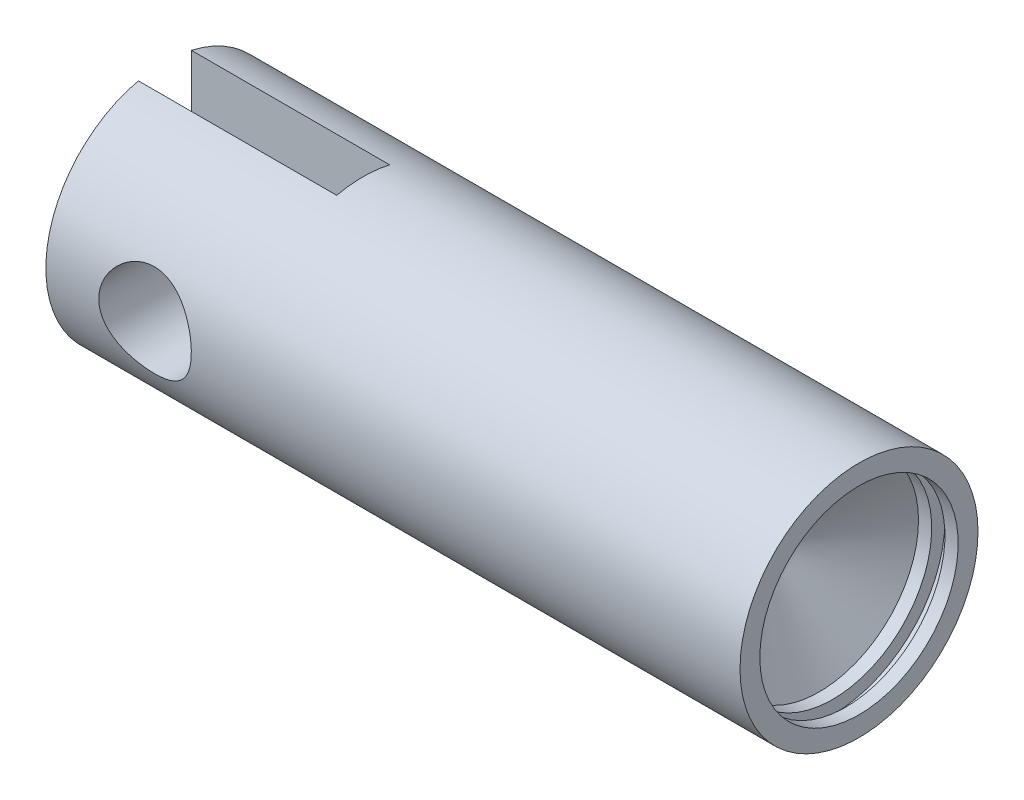
ISO-10303-21;
HEADER;
FILE_DESCRIPTION(('STEP AP214'),'2;1');
FILE_NAME('part.step','',(''),(''),'','','');
FILE_SCHEMA(('AUTOMOTIVE_DESIGN { 1 0 10303 214 1 1 1 1 }'));
ENDSEC;
DATA;
#1=APPLICATION_CONTEXT('core data for automotive mechanical design processes');
#2=APPLICATION_PROTOCOL_DEFINITION('international standard','automotive_design',2000,#1);
#3=PRODUCT_CONTEXT('',#1,'mechanical');
#4=PRODUCT('Part','Part','',(#3));
#5=PRODUCT_RELATED_PRODUCT_CATEGORY('part','',(#4));
#6=PRODUCT_DEFINITION_FORMATION('','',#4);
#7=PRODUCT_DEFINITION_CONTEXT('part definition',#1,'design');
#8=PRODUCT_DEFINITION('design','',#6,#7);
#9=PRODUCT_DEFINITION_SHAPE('','',#8);
#10=(LENGTH_UNIT() NAMED_UNIT(*) SI_UNIT(.MILLI.,.METRE.));
#11=(NAMED_UNIT(*) PLANE_ANGLE_UNIT() SI_UNIT($,.RADIAN.));
#12=(NAMED_UNIT(*) SI_UNIT($,.STERADIAN.) SOLID_ANGLE_UNIT());
#13=UNCERTAINTY_MEASURE_WITH_UNIT(LENGTH_MEASURE(1.E-05),#10,'distance_accuracy_value','');
#14=(GEOMETRIC_REPRESENTATION_CONTEXT(3) GLOBAL_UNCERTAINTY_ASSIGNED_CONTEXT((#13)) GLOBAL_UNIT_ASSIGNED_CONTEXT((#10,
#11,#12)) REPRESENTATION_CONTEXT('',''));
#15=CARTESIAN_POINT('',(0.,0.,0.));
#16=DIRECTION('',(0.,0.,1.));
#17=DIRECTION('',(1.,0.,0.));
#18=AXIS2_PLACEMENT_3D('',#15,#16,#17);
#19=CARTESIAN_POINT('',(30.,17.5499287747884,-3.99999999999915));
#20=DIRECTION('',(0.,0.,-1.));
#21=DIRECTION('',(0.,1.,0.));
#22=AXIS2_PLACEMENT_3D('',#19,#20,#21);
#23=PLANE('',#22);
#24=DIRECTION('',(0.,-1.,0.));
#25=VECTOR('',#24,1.);
#26=CARTESIAN_POINT('',(0.,17.5499287747884,-3.99999999999915));
#27=LINE('',#26,#25);
#28=CARTESIAN_POINT('',(0.,17.5499287747844,-3.99999999999915));
#29=VERTEX_POINT('',#28);
#30=CARTESIAN_POINT('',(0.,-17.5499287747884,-3.99999999999914));
#31=VERTEX_POINT('',#30);
#32=EDGE_CURVE('E117',#29,#31,#27,.T.);
#33=ORIENTED_EDGE('',*,*,#32,.T.);
#34=DIRECTION('',(-1.,0.,0.));
#35=VECTOR('',#34,1.);
#36=CARTESIAN_POINT('',(30.,-17.5499287747884,-3.99999999999914));
#37=LINE('',#36,#35);
#38=CARTESIAN_POINT('',(30.,-17.5499287747884,-3.99999999999914));
#39=VERTEX_POINT('',#38);
#40=EDGE_CURVE('E125',#39,#31,#37,.T.);
#41=ORIENTED_EDGE('',*,*,#40,.F.);
#42=DIRECTION('',(0.,-1.,0.));
#43=VECTOR('',#42,1.);
#44=CARTESIAN_POINT('',(30.,17.5499287747884,-3.99999999999915));
#45=LINE('',#44,#43);
#46=CARTESIAN_POINT('',(30.,17.5499287747884,-3.99999999999915));
#47=VERTEX_POINT('',#46);
#48=EDGE_CURVE('E132',#47,#39,#45,.T.);
#49=ORIENTED_EDGE('',*,*,#48,.F.);
#50=DIRECTION('',(-1.,0.,0.));
#51=VECTOR('',#50,1.);
#52=CARTESIAN_POINT('',(30.,17.5499287747884,-3.99999999999915));
#53=LINE('',#52,#51);
#54=EDGE_CURVE('E58',#47,#29,#53,.T.);
#55=ORIENTED_EDGE('',*,*,#54,.T.);
#56=EDGE_LOOP('',(#33,#41,#49,#55));
#57=FACE_BOUND('',#56,.T.);
#58=CARTESIAN_POINT('',(15.,0.,-3.99999999999914));
#59=DIRECTION('',(0.,0.,1.));
#60=DIRECTION('',(1.,0.,0.));
#61=AXIS2_PLACEMENT_3D('',#58,#59,#60);
#62=CIRCLE('',#61,6.99999999999999);
#63=CARTESIAN_POINT('',(22.,0.,-3.99999999999914));
#64=VERTEX_POINT('',#63);
#65=EDGE_CURVE('E191',#64,#64,#62,.T.);
#66=ORIENTED_EDGE('',*,*,#65,.F.);
#67=EDGE_LOOP('',(#66));
#68=FACE_BOUND('',#67,.T.);
#69=ADVANCED_FACE('F35',(#57,#68),#23,.F.);
#70=CARTESIAN_POINT('',(0.,-17.5499287747884,3.99999999999915));
#71=DIRECTION('',(0.,0.,1.));
#72=DIRECTION('',(0.,-1.,0.));
#73=AXIS2_PLACEMENT_3D('',#70,#71,#72);
#74=PLANE('',#73);
#75=DIRECTION('',(0.,-1.,0.));
#76=VECTOR('',#75,1.);
#77=CARTESIAN_POINT('',(30.,-17.5499287747884,3.99999999999915));
#78=LINE('',#77,#76);
#79=CARTESIAN_POINT('',(30.,17.5499287747884,3.99999999999915));
#80=VERTEX_POINT('',#79);
#81=CARTESIAN_POINT('',(30.,-17.5499287747884,3.99999999999915));
#82=VERTEX_POINT('',#81);
#83=EDGE_CURVE('E145',#80,#82,#78,.T.);
#84=ORIENTED_EDGE('',*,*,#83,.T.);
#85=DIRECTION('',(1.,0.,0.));
#86=VECTOR('',#85,1.);
#87=CARTESIAN_POINT('',(0.,-17.5499287747884,3.99999999999915));
#88=LINE('',#87,#86);
#89=CARTESIAN_POINT('',(0.,-17.5499287747884,3.99999999999915));
#90=VERTEX_POINT('',#89);
#91=EDGE_CURVE('E138',#90,#82,#88,.T.);
#92=ORIENTED_EDGE('',*,*,#91,.F.);
#93=DIRECTION('',(0.,-1.,0.));
#94=VECTOR('',#93,1.);
#95=CARTESIAN_POINT('',(0.,-17.5499287747884,3.99999999999915));
#96=LINE('',#95,#94);
#97=CARTESIAN_POINT('',(0.,17.5499287747884,3.99999999999915));
#98=VERTEX_POINT('',#97);
#99=EDGE_CURVE('E140',#98,#90,#96,.T.);
#100=ORIENTED_EDGE('',*,*,#99,.F.);
#101=DIRECTION('',(1.,0.,0.));
#102=VECTOR('',#101,1.);
#103=CARTESIAN_POINT('',(0.,17.5499287747884,3.99999999999915));
#104=LINE('',#103,#102);
#105=EDGE_CURVE('E50',#98,#80,#104,.T.);
#106=ORIENTED_EDGE('',*,*,#105,.T.);
#107=EDGE_LOOP('',(#84,#92,#100,#106));
#108=FACE_BOUND('',#107,.T.);
#109=CARTESIAN_POINT('',(15.,0.,3.99999999999915));
#110=DIRECTION('',(0.,0.,-1.));
#111=DIRECTION('',(0.,1.,0.));
#112=AXIS2_PLACEMENT_3D('',#109,#110,#111);
#113=CIRCLE('',#112,6.99999999999999);
#114=CARTESIAN_POINT('',(15.,6.99999999999999,3.99999999999915));
#115=VERTEX_POINT('',#114);
#116=EDGE_CURVE('E172',#115,#115,#113,.T.);
#117=ORIENTED_EDGE('',*,*,#116,.F.);
#118=EDGE_LOOP('',(#117));
#119=FACE_BOUND('',#118,.T.);
#120=ADVANCED_FACE('F96',(#108,#119),#74,.F.);
#121=CARTESIAN_POINT('',(30.,0.,0.));
#122=DIRECTION('',(-1.,0.,0.));
#123=DIRECTION('',(0.,0.,1.));
#124=AXIS2_PLACEMENT_3D('',#121,#122,#123);
#125=PLANE('',#124);
#126=CARTESIAN_POINT('',(30.,0.,0.));
#127=DIRECTION('',(-1.,0.,0.));
#128=DIRECTION('',(0.,0.,1.));
#129=AXIS2_PLACEMENT_3D('',#126,#127,#128);
#130=CIRCLE('',#129,18.0000000000038);
#131=EDGE_CURVE('E128',#39,#82,#130,.T.);
#132=ORIENTED_EDGE('',*,*,#131,.T.);
#133=ORIENTED_EDGE('',*,*,#83,.F.);
#134=EDGE_CURVE('E119',#80,#47,#130,.T.);
#135=ORIENTED_EDGE('',*,*,#134,.T.);
#136=ORIENTED_EDGE('',*,*,#48,.T.);
#137=EDGE_LOOP('',(#132,#133,#135,#136));
#138=FACE_BOUND('',#137,.T.);
#139=ADVANCED_FACE('F101',(#138),#125,.T.);
#140=CARTESIAN_POINT('',(0.,0.,0.));
#141=DIRECTION('',(1.,0.,0.));
#142=DIRECTION('',(0.,0.,-1.));
#143=AXIS2_PLACEMENT_3D('',#140,#141,#142);
#144=CYLINDRICAL_SURFACE('',#143,18.);
#145=CARTESIAN_POINT('',(8.00000000000001,0.,-18.));
#146=CARTESIAN_POINT('',(7.99999877163177,0.189022900178527,-18.0000009208547));
#147=CARTESIAN_POINT('',(8.00766202753387,0.378029556462484,-17.9970162909539));
#148=CARTESIAN_POINT('',(8.0382308714732,0.754619998576976,-17.9851613111076));
#149=CARTESIAN_POINT('',(8.06113593473041,0.9422038331708,-17.9762911638023));
#150=CARTESIAN_POINT('',(8.12194538683635,1.31451020157856,-17.9529064582995));
#151=CARTESIAN_POINT('',(8.15984587512876,1.49923346649966,-17.9383933679412));
#152=CARTESIAN_POINT('',(8.25027376964932,1.86456675510352,-17.9041072154366));
#153=CARTESIAN_POINT('',(8.30280166743677,2.04517664033399,-17.8843339765221));
#154=CARTESIAN_POINT('',(8.42186250909201,2.40065949507787,-17.8400910181496));
#155=CARTESIAN_POINT('',(8.48836353086228,2.57554450836756,-17.8156320145383));
#156=CARTESIAN_POINT('',(8.63490029203148,2.9189677930884,-17.7625963642901));
#157=CARTESIAN_POINT('',(8.71494074813499,3.0875038276357,-17.7340182832136));
#158=CARTESIAN_POINT('',(8.88790662276241,3.41715655500486,-17.6734582342022));
#159=CARTESIAN_POINT('',(8.98083049039882,3.5782741377447,-17.6414766760807));
#160=CARTESIAN_POINT('',(9.17894849436442,3.89227914275452,-17.5748665993156));
#161=CARTESIAN_POINT('',(9.28414706872086,4.04516355886975,-17.5402371248642));
#162=CARTESIAN_POINT('',(9.51061675484618,4.34785369100651,-17.4677233944295));
#163=CARTESIAN_POINT('',(9.63236649431697,4.49728345532205,-17.4297641064102));
#164=CARTESIAN_POINT('',(9.88762487385915,4.7854650103583,-17.3528548422097));
#165=CARTESIAN_POINT('',(10.021133887595,4.92421646150064,-17.3139048345752));
#166=CARTESIAN_POINT('',(10.2991940978516,5.19032503575433,-17.2360018270607));
#167=CARTESIAN_POINT('',(10.4437507057338,5.31767650772321,-17.1970488351724));
#168=CARTESIAN_POINT('',(10.7429852422145,5.56011631767769,-17.1202008105665));
#169=CARTESIAN_POINT('',(10.8976597568723,5.67520875795339,-17.0823054270897));
#170=CARTESIAN_POINT('',(11.2230349470368,5.8970258415522,-17.0070390963215));
#171=CARTESIAN_POINT('',(11.3941361617003,6.0031943031787,-16.9697573747049));
#172=CARTESIAN_POINT('',(11.745332601565,6.2006211312136,-16.8986185657432));
#173=CARTESIAN_POINT('',(11.9254244060335,6.29188511285885,-16.864760190498));
#174=CARTESIAN_POINT('',(12.2934662837199,6.45875311212804,-16.8015616289996));
#175=CARTESIAN_POINT('',(12.4814153071117,6.53435921386094,-16.772220841576));
#176=CARTESIAN_POINT('',(12.8638611580555,6.66918382637007,-16.7190683421261));
#177=CARTESIAN_POINT('',(13.0583575676936,6.72840338086888,-16.6952562779695));
#178=CARTESIAN_POINT('',(13.4438521316817,6.82761155137091,-16.6549231017409));
#179=CARTESIAN_POINT('',(13.634635798561,6.86832321082169,-16.6381304270352));
#180=CARTESIAN_POINT('',(14.0193787391505,6.9337183849563,-16.610984565868));
#181=CARTESIAN_POINT('',(14.2133377989043,6.95840297501636,-16.6006309473639));
#182=CARTESIAN_POINT('',(14.6028132230369,6.99145371248836,-16.586738613915));
#183=CARTESIAN_POINT('',(14.7983289832691,6.99982590767257,-16.5831973733075));
#184=CARTESIAN_POINT('',(15.1893731871952,7.0001686910317,-16.583052810344));
#185=CARTESIAN_POINT('',(15.3849016299824,6.99213998431722,-16.5864491897247));
#186=CARTESIAN_POINT('',(15.7616095749807,6.96084085820887,-16.5996070428288));
#187=CARTESIAN_POINT('',(15.9428910203047,6.93860183522661,-16.6089376087284));
#188=CARTESIAN_POINT('',(16.30285184566,6.8801042902642,-16.6332548734901));
#189=CARTESIAN_POINT('',(16.4815303621113,6.84384122067606,-16.6482434070357));
#190=CARTESIAN_POINT('',(16.8349854261477,6.75765586702763,-16.683412372051));
#191=CARTESIAN_POINT('',(17.0097629263059,6.7077369578859,-16.703591520633));
#192=CARTESIAN_POINT('',(17.3544388925943,6.59465916050385,-16.7485572520829));
#193=CARTESIAN_POINT('',(17.5243354588096,6.531495193909,-16.7733456017738));
#194=CARTESIAN_POINT('',(17.8614342235285,6.39110118759295,-16.82734642543));
#195=CARTESIAN_POINT('',(18.0285204777467,6.31362237478763,-16.8566352977992));
#196=CARTESIAN_POINT('',(18.3556537183782,6.14600522154402,-16.9184691455942));
#197=CARTESIAN_POINT('',(18.5156982928699,6.05586258713523,-16.9510152243725));
#198=CARTESIAN_POINT('',(18.8278716435968,5.86353255645025,-17.0185008071045));
#199=CARTESIAN_POINT('',(18.9799994265927,5.76134365407754,-17.0534406101067));
#200=CARTESIAN_POINT('',(19.2755564849081,5.54554789897213,-17.1248303146976));
#201=CARTESIAN_POINT('',(19.4189853359592,5.43194049004761,-17.1612802897953));
#202=CARTESIAN_POINT('',(19.7065515880351,5.18525090976585,-17.237488999054));
#203=CARTESIAN_POINT('',(19.8499773545664,5.05135263393821,-17.2772951275342));
#204=CARTESIAN_POINT('',(20.1250946367338,4.77198380388806,-17.3565331511009));
#205=CARTESIAN_POINT('',(20.2567896456181,4.62651671927617,-17.3959651544501));
#206=CARTESIAN_POINT('',(20.5077440220317,4.32472983792493,-17.4734366912438));
#207=CARTESIAN_POINT('',(20.626996438517,4.16840405534709,-17.5114754387286));
#208=CARTESIAN_POINT('',(20.8521226147386,3.84594718277663,-17.5851080736286));
#209=CARTESIAN_POINT('',(20.9580017141785,3.67982004539237,-17.6207029342324));
#210=CARTESIAN_POINT('',(21.1574465839447,3.33558623984551,-17.6891269218138));
#211=CARTESIAN_POINT('',(21.2507523190637,3.15731625673586,-17.7218937056245));
#212=CARTESIAN_POINT('',(21.4218805210754,2.79284146450667,-17.782973891696));
#213=CARTESIAN_POINT('',(21.4997091787971,2.60663986436766,-17.811289073644));
#214=CARTESIAN_POINT('',(21.6391715945256,2.22759348063694,-17.8626536301049));
#215=CARTESIAN_POINT('',(21.7008082230189,2.03474988138952,-17.8857039378683));
#216=CARTESIAN_POINT('',(21.8072544583429,1.64386977785006,-17.9258550536686));
#217=CARTESIAN_POINT('',(21.8520651583151,1.44583361180157,-17.9429562482004));
#218=CARTESIAN_POINT('',(21.9223149845053,1.05748077820151,-17.9699041828516));
#219=CARTESIAN_POINT('',(21.9487059179292,0.867360509164302,-17.9801063423545));
#220=CARTESIAN_POINT('',(21.9857878743697,0.485371080182076,-17.9944696419145));
#221=CARTESIAN_POINT('',(21.9964796173466,0.293502000843053,-17.9986310589982));
#222=CARTESIAN_POINT('',(22.0020479375566,-0.090459405330065,-18.0007963490226));
#223=CARTESIAN_POINT('',(21.9969277927261,-0.282551677641392,-17.9988014982092));
#224=CARTESIAN_POINT('',(21.9709350222173,-0.665503375076277,-17.9887128868814));
#225=CARTESIAN_POINT('',(21.9500626694723,-0.856362821502823,-17.980619232039));
#226=CARTESIAN_POINT('',(21.8940003311959,-1.22738012361879,-17.9590257121867));
#227=CARTESIAN_POINT('',(21.859451965618,-1.40764961369414,-17.9457684957337));
#228=CARTESIAN_POINT('',(21.7764231959551,-1.76455917223371,-17.9141965268711));
#229=CARTESIAN_POINT('',(21.727938219127,-1.94119802903447,-17.8958801145654));
#230=CARTESIAN_POINT('',(21.6174868653815,-2.28959732376108,-17.8546495416103));
#231=CARTESIAN_POINT('',(21.5555241965914,-2.4613590888587,-17.8317366457293));
#232=CARTESIAN_POINT('',(21.4185958115425,-2.79907910782926,-17.7818533163451));
#233=CARTESIAN_POINT('',(21.3436251532677,-2.96503512707432,-17.7548813412285));
#234=CARTESIAN_POINT('',(21.1788475539973,-3.29497337994161,-17.696667533927));
#235=CARTESIAN_POINT('',(21.0886656702547,-3.4587501066948,-17.6653225666838));
#236=CARTESIAN_POINT('',(20.8957586183553,-3.77820881792742,-17.5997653465878));
#237=CARTESIAN_POINT('',(20.7930291470216,-3.9338879991195,-17.5655521113354));
#238=CARTESIAN_POINT('',(20.5757131397511,-4.23628328543234,-17.4950853783795));
#239=CARTESIAN_POINT('',(20.4611247099329,-4.38299795294747,-17.4588315552162));
#240=CARTESIAN_POINT('',(20.2207940206465,-4.66667675024355,-17.3851548379621));
#241=CARTESIAN_POINT('',(20.095051310869,-4.80364048596697,-17.3477318967124));
#242=CARTESIAN_POINT('',(19.8248986311353,-5.07536393749629,-17.2702597460267));
#243=CARTESIAN_POINT('',(19.6798126145301,-5.20944741445195,-17.2301929476455));
#244=CARTESIAN_POINT('',(19.3787518605832,-5.46493358179961,-17.1508714679136));
#245=CARTESIAN_POINT('',(19.2227805751698,-5.58634026203641,-17.1116165341782));
#246=CARTESIAN_POINT('',(18.9007254882981,-5.81579327720082,-17.0349989757533));
#247=CARTESIAN_POINT('',(18.7346362952503,-5.92383239427614,-16.9976373797493));
#248=CARTESIAN_POINT('',(18.3934750322044,-6.12565012207101,-16.9259528059704));
#249=CARTESIAN_POINT('',(18.2184067825543,-6.21943473147827,-16.8916285525535));
#250=CARTESIAN_POINT('',(17.8589525651865,-6.39269060733609,-16.8268277439491));
#251=CARTESIAN_POINT('',(17.6745061810053,-6.47204835125026,-16.7963822262176));
#252=CARTESIAN_POINT('',(17.2988589562015,-6.61480150738732,-16.7406772868191));
#253=CARTESIAN_POINT('',(17.1076610192138,-6.67820368852061,-16.7154156668028));
#254=CARTESIAN_POINT('',(16.7199157805218,-6.78840894602035,-16.6709639534454));
#255=CARTESIAN_POINT('',(16.5233703985785,-6.83521789694062,-16.6517717116032));
#256=CARTESIAN_POINT('',(16.1264440490539,-6.91172661427567,-16.6201611539775));
#257=CARTESIAN_POINT('',(15.9260633791263,-6.94142770289986,-16.6077423147044));
#258=CARTESIAN_POINT('',(15.536996100839,-6.9819213566805,-16.5907569628281));
#259=CARTESIAN_POINT('',(15.3484500694618,-6.99387109240177,-16.5857102986191));
#260=CARTESIAN_POINT('',(14.9709492443818,-7.00248500762121,-16.5820755174959));
#261=CARTESIAN_POINT('',(14.7819944665941,-6.99914977192882,-16.5834871534844));
#262=CARTESIAN_POINT('',(14.4051531955539,-6.97723284578585,-16.592720118049));
#263=CARTESIAN_POINT('',(14.21726658829,-6.9586528144681,-16.6005407491165));
#264=CARTESIAN_POINT('',(13.8439590479773,-6.90645280959917,-16.6223255636815));
#265=CARTESIAN_POINT('',(13.6585381083135,-6.87283287640587,-16.6362897306936));
#266=CARTESIAN_POINT('',(13.2980402415482,-6.79236485986737,-16.6693009987579));
#267=CARTESIAN_POINT('',(13.1228300364028,-6.74603016350141,-16.688149505643));
#268=CARTESIAN_POINT('',(12.7769967073649,-6.64010367997225,-16.7305790866883));
#269=CARTESIAN_POINT('',(12.6063751066609,-6.58050755009856,-16.7541617108778));
#270=CARTESIAN_POINT('',(12.2707956133919,-6.44856072715021,-16.8053880459059));
#271=CARTESIAN_POINT('',(12.1058368326919,-6.37621204515715,-16.8330311162965));
#272=CARTESIAN_POINT('',(11.7824247617755,-6.21928928238683,-16.891638582713));
#273=CARTESIAN_POINT('',(11.6239740303943,-6.13471045093825,-16.922604268162));
#274=CARTESIAN_POINT('',(11.1427026763286,-5.85354969616637,-17.022836929794));
#275=CARTESIAN_POINT('',(10.832339438266,-5.63672493370866,-17.0965173551352));
#276=CARTESIAN_POINT('',(10.2509761190353,-5.15645525559416,-17.2474378809038));
#277=CARTESIAN_POINT('',(9.9799890674931,-4.89299497186818,-17.3246791485313));
#278=CARTESIAN_POINT('',(9.60017410927497,-4.45891382375773,-17.4396791777228));
#279=CARTESIAN_POINT('',(9.47494185076698,-4.30277213888834,-17.4789502311137));
#280=CARTESIAN_POINT('',(9.23809110218057,-3.9800036583569,-17.5552562694741));
#281=CARTESIAN_POINT('',(9.12646760311397,-3.81338075496761,-17.5922920746234));
#282=CARTESIAN_POINT('',(8.91759749101006,-3.47054816799777,-17.6631242394416));
#283=CARTESIAN_POINT('',(8.82036043825045,-3.29433221494907,-17.6969184397567));
#284=CARTESIAN_POINT('',(8.64120231869494,-2.93363627499294,-17.7602727701874));
#285=CARTESIAN_POINT('',(8.55927490643538,-2.74915975136256,-17.7898346532993));
#286=CARTESIAN_POINT('',(8.40585634402471,-2.35891513657034,-17.8459307335606));
#287=CARTESIAN_POINT('',(8.33562444739601,-2.15259234031402,-17.8720664148204));
#288=CARTESIAN_POINT('',(8.21455528641545,-1.73357991619569,-17.917564278894));
#289=CARTESIAN_POINT('',(8.16371962488026,-1.52088976372987,-17.9369259019194));
#290=CARTESIAN_POINT('',(8.08212905092707,-1.0912590383903,-17.9681806798842));
#291=CARTESIAN_POINT('',(8.05136391194008,-0.87432068824148,-17.9800776381891));
#292=CARTESIAN_POINT('',(8.01030171598621,-0.438247381222032,-17.9959861413564));
#293=CARTESIAN_POINT('',(8.00000142390778,-0.219112777043785,-17.9999989325577));
#294=CARTESIAN_POINT('',(8.00000000000001,0.,-18.));
#295=B_SPLINE_CURVE_WITH_KNOTS('',3,(#145,#146,#147,#148,#149,#150,#151,#152,#153,#154,#155,
#156,#157,#158,#159,#160,#161,#162,#163,#164,#165,#166,#167,#168,#169,#170,#171,#172,#173,#174,
#175,#176,#177,#178,#179,#180,#181,#182,#183,#184,#185,#186,#187,#188,#189,#190,#191,#192,#193,
#194,#195,#196,#197,#198,#199,#200,#201,#202,#203,#204,#205,#206,#207,#208,#209,#210,#211,#212,
#213,#214,#215,#216,#217,#218,#219,#220,#221,#222,#223,#224,#225,#226,#227,#228,#229,#230,#231,
#232,#233,#234,#235,#236,#237,#238,#239,#240,#241,#242,#243,#244,#245,#246,#247,#248,#249,#250,
#251,#252,#253,#254,#255,#256,#257,#258,#259,#260,#261,#262,#263,#264,#265,#266,#267,#268,#269,
#270,#271,#272,#273,#274,#275,#276,#277,#278,#279,#280,#281,#282,#283,#284,#285,#286,#287,#288,
#289,#290,#291,#292,#293,#294),.UNSPECIFIED.,.T.,.F.,(4,2,2,2,2,2,2,2,2,2,2,2,2,2,2,2,2,2,2,2,2,
2,2,2,2,2,2,2,2,2,2,2,2,2,2,2,2,2,2,2,2,2,2,2,2,2,2,2,2,2,2,2,2,2,2,2,2,2,2,2,2,2,2,2,2,2,2,2,2,
2,2,2,2,2,4),(0.,0.566862759352124,1.13370600245867,1.70040189716278,2.26711683818315,
2.83255090786465,3.39818236383889,3.96374578889449,4.52951433569611,5.11821464019695,
5.70693365808009,6.29594291522282,6.88475444641585,7.49835189280634,8.11171763145428,
8.72500167680878,9.33824665073364,9.92487834644438,10.5114706765685,11.0978454879039,
11.6841950902353,12.232188490834,12.780359739642,13.328395635032,13.8766420411072,
14.4355085544116,14.9945650241531,15.5536914647608,16.1128451534507,16.7127901419188,
17.312555874074,17.9126548908278,18.5125135372255,19.1233215539829,19.7338847539823,
20.3443396415584,20.9547548624394,21.5306662531041,22.1065512318175,22.6823168327752,
23.2580724578568,23.8095224039811,24.3611534933436,24.9126330035783,25.4643224934078,
26.032420335406,26.60071355567,27.1690976730936,27.7375047472013,28.3415392882368,
28.9453831411251,29.5495516313203,30.1534651626654,30.7619424965476,31.370161256143,
31.9781644705661,32.5861206881493,33.1523785687522,33.7186147842715,34.2847893829266,
34.8509624623251,35.3969849891128,35.9431865852651,36.4893021221874,37.0356303645832,
38.1874510523993,39.3396520152851,39.9509492720584,40.5620208444357,41.1734966879108,
41.7847185250417,42.4422030112358,43.099741817197,43.7569453240233,44.4140449309335),.UNSPECIFIED.);
#296=CARTESIAN_POINT('',(8.00000000000001,0.,-18.));
#297=VERTEX_POINT('',#296);
#298=EDGE_CURVE('E186',#297,#297,#295,.T.);
#299=ORIENTED_EDGE('',*,*,#298,.F.);
#300=EDGE_LOOP('',(#299));
#301=FACE_BOUND('',#300,.T.);
#302=CARTESIAN_POINT('',(15.,6.99999999999999,16.583123951777));
#303=CARTESIAN_POINT('',(14.8115900810471,7.00000128679394,16.5831227411057));
#304=CARTESIAN_POINT('',(14.623196723668,6.99238720394823,16.5863434351153));
#305=CARTESIAN_POINT('',(14.2478504071344,6.96201946274949,16.5991132379802));
#306=CARTESIAN_POINT('',(14.0608974047931,6.93926626011891,16.6086621563412));
#307=CARTESIAN_POINT('',(13.6898560140149,6.87887000409433,16.6337672101336));
#308=CARTESIAN_POINT('',(13.5057672415623,6.8412289649497,16.6493225329218));
#309=CARTESIAN_POINT('',(13.1417210462877,6.75144057491857,16.6859340999994));
#310=CARTESIAN_POINT('',(12.9617637763467,6.6992926881581,16.7069905474951));
#311=CARTESIAN_POINT('',(12.6076755033581,6.58114902000783,16.7538801539233));
#312=CARTESIAN_POINT('',(12.4335295281508,6.51519262556483,16.7796997023639));
#313=CARTESIAN_POINT('',(12.09153050467,6.36987750857182,16.8354005896117));
#314=CARTESIAN_POINT('',(11.9236796849456,6.29051409351783,16.8652833498402));
#315=CARTESIAN_POINT('',(11.5952943410424,6.11901056800262,16.9282618581035));
#316=CARTESIAN_POINT('',(11.4347591567962,6.02687161328373,16.9613573154197));
#317=CARTESIAN_POINT('',(11.1217827628084,5.83040175843883,17.0298925614112));
#318=CARTESIAN_POINT('',(10.9693445165565,5.72606643854078,17.0653331979113));
#319=CARTESIAN_POINT('',(10.6662107207034,5.50051558216541,17.1394016700591));
#320=CARTESIAN_POINT('',(10.5159590945143,5.37872643902607,17.1781007069678));
#321=CARTESIAN_POINT('',(10.2261146747707,5.12321632918427,17.2560276847205));
#322=CARTESIAN_POINT('',(10.0865221686754,4.98949504090211,17.2952556397952));
#323=CARTESIAN_POINT('',(9.81874725334541,4.71083560104523,17.3732255130968));
#324=CARTESIAN_POINT('',(9.69056948039886,4.56589293599551,17.4119672283905));
#325=CARTESIAN_POINT('',(9.44651880180743,4.26570652365337,17.4879303501059));
#326=CARTESIAN_POINT('',(9.33064164921224,4.11046636198385,17.5251522785047));
#327=CARTESIAN_POINT('',(9.10781262330678,3.78451386848839,17.5984768668056));
#328=CARTESIAN_POINT('',(9.00135807285283,3.61343970797923,17.6344852834755));
#329=CARTESIAN_POINT('',(8.80336009216198,3.26224941911282,17.702816524058));
#330=CARTESIAN_POINT('',(8.71181102771753,3.08213674111173,17.7351407391901));
#331=CARTESIAN_POINT('',(8.54439224288661,2.71403828441499,17.7951893341569));
#332=CARTESIAN_POINT('',(8.46852118182209,2.52605318057134,17.8229141072652));
#333=CARTESIAN_POINT('',(8.33319630131231,2.14356549827356,17.872949258056));
#334=CARTESIAN_POINT('',(8.27374149676238,1.94906331168149,17.8952599606157));
#335=CARTESIAN_POINT('',(8.17422589367958,1.56412606980011,17.9329074915352));
#336=CARTESIAN_POINT('',(8.13339842565049,1.37391584239362,17.9485180329237));
#337=CARTESIAN_POINT('',(8.06768363666554,0.990373427060974,17.973761074221));
#338=CARTESIAN_POINT('',(8.04279542935818,0.797041413344374,17.9833939065377));
#339=CARTESIAN_POINT('',(8.00923348678218,0.408820372835877,17.9964045554227));
#340=CARTESIAN_POINT('',(8.00055513834585,0.213931804885309,17.9997841515984));
#341=CARTESIAN_POINT('',(7.99949653775896,-0.1758932916871,18.0001957521713));
#342=CARTESIAN_POINT('',(8.00711574935668,-0.370829818519885,17.9972279654216));
#343=CARTESIAN_POINT('',(8.03772344667713,-0.748810522584479,17.9853582654493));
#344=CARTESIAN_POINT('',(8.05986951916187,-0.931933896086255,17.9767816847946));
#345=CARTESIAN_POINT('',(8.11847734125509,-1.29559937907926,17.954236885668));
#346=CARTESIAN_POINT('',(8.15494377542237,-1.4761406238393,17.9402669029007));
#347=CARTESIAN_POINT('',(8.24183447235957,-1.83329406565323,17.9072942700767));
#348=CARTESIAN_POINT('',(8.29225417891056,-2.00990752495953,17.8882932629084));
#349=CARTESIAN_POINT('',(8.40663075681922,-2.35819710443708,17.8457194134522));
#350=CARTESIAN_POINT('',(8.47059276494293,-2.52987132294501,17.8221448366364));
#351=CARTESIAN_POINT('',(8.61253797870667,-2.86961899070764,17.7706284540049));
#352=CARTESIAN_POINT('',(8.69071078232882,-3.03760431851401,17.7426283590598));
#353=CARTESIAN_POINT('',(8.8598584942467,-3.36643149246933,17.6831860329726));
#354=CARTESIAN_POINT('',(8.95083776093999,-3.52727088203606,17.6517426307889));
#355=CARTESIAN_POINT('',(9.14494766239164,-3.84088189286682,17.5861677030201));
#356=CARTESIAN_POINT('',(9.24807945145502,-3.99365274574331,17.552035922182));
#357=CARTESIAN_POINT('',(9.46583142420842,-4.29031926518941,17.4818877479357));
#358=CARTESIAN_POINT('',(9.58045218034975,-4.43421448894275,17.4458712606625));
#359=CARTESIAN_POINT('',(9.82804028674366,-4.72111731853226,17.3705039195901));
#360=CARTESIAN_POINT('',(9.96170724927793,-4.86350410875167,17.3310855590773));
#361=CARTESIAN_POINT('',(10.2403988761419,-5.13655967226694,17.2521289296782));
#362=CARTESIAN_POINT('',(10.3854201697628,-5.26723189868846,17.2125906997026));
#363=CARTESIAN_POINT('',(10.6861180430487,-5.51620772557328,17.1344241619204));
#364=CARTESIAN_POINT('',(10.8418015290674,-5.63450318127488,17.095796466098));
#365=CARTESIAN_POINT('',(11.1627894833645,-5.85781752115052,17.0205715245421));
#366=CARTESIAN_POINT('',(11.3280901819913,-5.96284155678965,16.9839734940836));
#367=CARTESIAN_POINT('',(11.6718194642605,-6.16146298786693,16.9129474117728));
#368=CARTESIAN_POINT('',(11.8504773977324,-6.2546931566598,16.8786003117024));
#369=CARTESIAN_POINT('',(12.2157498280901,-6.42561995750687,16.8142722183767));
#370=CARTESIAN_POINT('',(12.402361078898,-6.50332285459962,16.7842894654994));
#371=CARTESIAN_POINT('',(12.7822589053095,-6.64247933881486,16.7297058899987));
#372=CARTESIAN_POINT('',(12.9755435691758,-6.7039375366102,16.7051035406182));
#373=CARTESIAN_POINT('',(13.3673682093257,-6.80997032682747,16.6621602708207));
#374=CARTESIAN_POINT('',(13.5659077897165,-6.85454618727263,16.6438188801567));
#375=CARTESIAN_POINT('',(13.9548943165557,-6.92419537514557,16.6149587041555));
#376=CARTESIAN_POINT('',(14.1451354107463,-6.95025688038927,16.6040451330255));
#377=CARTESIAN_POINT('',(14.5273733346564,-6.98666411994538,16.5887588017757));
#378=CARTESIAN_POINT('',(14.7193700680826,-6.99701071104899,16.5843856850644));
#379=CARTESIAN_POINT('',(15.1035530683326,-7.0018693793594,16.5823349278421));
#380=CARTESIAN_POINT('',(15.2957392797425,-6.99638519239517,16.5846557076704));
#381=CARTESIAN_POINT('',(15.6788133190452,-6.96965387501007,16.5959071684227));
#382=CARTESIAN_POINT('',(15.8697011760147,-6.94840709877418,16.6048377008256));
#383=CARTESIAN_POINT('',(16.2386665423968,-6.89192842912343,16.6283552873772));
#384=CARTESIAN_POINT('',(16.416887849359,-6.85749511769555,16.6426183999785));
#385=CARTESIAN_POINT('',(16.7697087239474,-6.77502490915156,16.6763611420592));
#386=CARTESIAN_POINT('',(16.9443070943445,-6.72698358964058,16.695842467266));
#387=CARTESIAN_POINT('',(17.2886955281192,-6.61774154048119,16.7394429540286));
#388=CARTESIAN_POINT('',(17.4584865470418,-6.55654344704883,16.7635611863875));
#389=CARTESIAN_POINT('',(17.7923781249087,-6.4214540950881,16.8157714424384));
#390=CARTESIAN_POINT('',(17.956476475205,-6.34755797472214,16.8438649874735));
#391=CARTESIAN_POINT('',(18.2842878595686,-6.18451724104097,16.9044253624098));
#392=CARTESIAN_POINT('',(18.4477380644342,-6.09489162492806,16.9370197226022));
#393=CARTESIAN_POINT('',(18.7666384950572,-5.90314033302161,17.0048015181189));
#394=CARTESIAN_POINT('',(18.922085951168,-5.80101037040205,17.0399898410689));
#395=CARTESIAN_POINT('',(19.224140862256,-5.58490148175722,17.1120380825252));
#396=CARTESIAN_POINT('',(19.3707468286755,-5.47092056925057,17.1488982806891));
#397=CARTESIAN_POINT('',(19.6543400516313,-5.23178034234773,17.2233607838299));
#398=CARTESIAN_POINT('',(19.7913269597997,-5.1066206234679,17.2609631156212));
#399=CARTESIAN_POINT('',(20.0641111960304,-4.83674418460085,17.3385973443421));
#400=CARTESIAN_POINT('',(20.1991669799386,-4.69127310875218,17.3786168559124));
#401=CARTESIAN_POINT('',(20.4565543539211,-4.3892336424464,17.4573472781123));
#402=CARTESIAN_POINT('',(20.5788900113233,-4.23266882636355,17.4960586043521));
#403=CARTESIAN_POINT('',(20.8101004347604,-3.90925334383612,17.5711497729232));
#404=CARTESIAN_POINT('',(20.9189692090444,-3.74239814806971,17.6075285740137));
#405=CARTESIAN_POINT('',(21.122310431655,-3.39956129060659,17.6769214767847));
#406=CARTESIAN_POINT('',(21.2167890505066,-3.22358358429388,17.7099370186141));
#407=CARTESIAN_POINT('',(21.3904939663113,-2.86381446500393,17.7716579999589));
#408=CARTESIAN_POINT('',(21.469740248761,-2.68003368215184,17.8003690760824));
#409=CARTESIAN_POINT('',(21.6123667062819,-2.30579399503419,17.8527026343005));
#410=CARTESIAN_POINT('',(21.6757534807375,-2.11533790620462,17.8763272323838));
#411=CARTESIAN_POINT('',(21.7860452746469,-1.72913530596329,17.9178067253647));
#412=CARTESIAN_POINT('',(21.8329537364452,-1.53338990870837,17.9356628252477));
#413=CARTESIAN_POINT('',(21.9097889411243,-1.13813095008718,17.9650749986814));
#414=CARTESIAN_POINT('',(21.939716753633,-0.938617626884493,17.9766314690502));
#415=CARTESIAN_POINT('',(21.9809253383782,-0.549965707301244,17.9925813958946));
#416=CARTESIAN_POINT('',(21.993250016969,-0.360953539363375,17.9973756227606));
#417=CARTESIAN_POINT('',(22.0025365503424,0.017502869662163,18.0009860293738));
#418=CARTESIAN_POINT('',(21.9994989161556,0.206947096167768,17.9998024079753));
#419=CARTESIAN_POINT('',(21.9780947003793,0.584808353082135,17.991489918235));
#420=CARTESIAN_POINT('',(21.9597301452869,0.773225515972598,17.984361835859));
#421=CARTESIAN_POINT('',(21.9078660830206,1.14765314980438,17.9643547636442));
#422=CARTESIAN_POINT('',(21.8743666100478,1.33366362618321,17.951475786801));
#423=CARTESIAN_POINT('',(21.7937174766183,1.69676624875538,17.9207491411132));
#424=CARTESIAN_POINT('',(21.7469769325198,1.87396221317745,17.9030509300627));
#425=CARTESIAN_POINT('',(21.6399198401346,2.22371942465972,17.8629805132364));
#426=CARTESIAN_POINT('',(21.5795988039122,2.3962791184255,17.8406067625142));
#427=CARTESIAN_POINT('',(21.4459000410618,2.7356191510041,17.7917327645143));
#428=CARTESIAN_POINT('',(21.3725252210104,2.9024007665167,17.7652334360081));
#429=CARTESIAN_POINT('',(21.2132721591003,3.22929592679445,17.7087330141515));
#430=CARTESIAN_POINT('',(21.1273890807962,3.38940686133523,17.6787305671785));
#431=CARTESIAN_POINT('',(20.8439688633765,3.87179997789486,17.58179246987));
#432=CARTESIAN_POINT('',(20.6263634468023,4.18161914370794,17.5100936193741));
#433=CARTESIAN_POINT('',(20.1448818823453,4.76154998906066,17.3613807697664));
#434=CARTESIAN_POINT('',(19.8809887809482,5.03164705295476,17.2843648294848));
#435=CARTESIAN_POINT('',(19.4469410216878,5.40966452230522,17.1684103987717));
#436=CARTESIAN_POINT('',(19.2911116004598,5.53409098991004,17.1286079742693));
#437=CARTESIAN_POINT('',(18.969135647831,5.76937376319989,17.0507964177092));
#438=CARTESIAN_POINT('',(18.8029928976049,5.88023499852817,17.0127866373041));
#439=CARTESIAN_POINT('',(18.4612475654085,6.08767252647553,16.9396682002635));
#440=CARTESIAN_POINT('',(18.2856383952808,6.1842386906779,16.9045616083095));
#441=CARTESIAN_POINT('',(17.9262386751205,6.36217845813806,16.8383993870184));
#442=CARTESIAN_POINT('',(17.7424515656115,6.4435583769108,16.8073420753306));
#443=CARTESIAN_POINT('',(17.3534434251809,6.59607704855772,16.7481037844332));
#444=CARTESIAN_POINT('',(17.1476608637023,6.66594736415582,16.7203275358053));
#445=CARTESIAN_POINT('',(16.7296967045873,6.78641667669021,16.6717958126584));
#446=CARTESIAN_POINT('',(16.5175146246567,6.83701421721395,16.6510408687413));
#447=CARTESIAN_POINT('',(16.0888866388623,6.91822741929309,16.6174626670805));
#448=CARTESIAN_POINT('',(15.872443778453,6.94885685471938,16.6046339422017));
#449=CARTESIAN_POINT('',(15.4373262618032,6.9897407234796,16.5874659849255));
#450=CARTESIAN_POINT('',(15.2186519784357,6.99999850666013,16.5831253567756));
#451=CARTESIAN_POINT('',(15.,6.99999999999999,16.583123951777));
#452=B_SPLINE_CURVE_WITH_KNOTS('',3,(#302,#303,#304,#305,#306,#307,#308,#309,#310,#311,#312,
#313,#314,#315,#316,#317,#318,#319,#320,#321,#322,#323,#324,#325,#326,#327,#328,#329,#330,#331,
#332,#333,#334,#335,#336,#337,#338,#339,#340,#341,#342,#343,#344,#345,#346,#347,#348,#349,#350,
#351,#352,#353,#354,#355,#356,#357,#358,#359,#360,#361,#362,#363,#364,#365,#366,#367,#368,#369,
#370,#371,#372,#373,#374,#375,#376,#377,#378,#379,#380,#381,#382,#383,#384,#385,#386,#387,#388,
#389,#390,#391,#392,#393,#394,#395,#396,#397,#398,#399,#400,#401,#402,#403,#404,#405,#406,#407,
#408,#409,#410,#411,#412,#413,#414,#415,#416,#417,#418,#419,#420,#421,#422,#423,#424,#425,#426,
#427,#428,#429,#430,#431,#432,#433,#434,#435,#436,#437,#438,#439,#440,#441,#442,#443,#444,#445,
#446,#447,#448,#449,#450,#451),.UNSPECIFIED.,.T.,.F.,(4,2,2,2,2,2,2,2,2,2,2,2,2,2,2,2,2,2,2,2,2,
2,2,2,2,2,2,2,2,2,2,2,2,2,2,2,2,2,2,2,2,2,2,2,2,2,2,2,2,2,2,2,2,2,2,2,2,2,2,2,2,2,2,2,2,2,2,2,2,
2,2,2,2,2,4),(0.,0.565021042583451,1.13002507749888,1.69495269634509,2.25990118603955,
2.82325966965624,3.38681574078896,3.95032086290631,4.51403082724088,5.10510900977508,
5.69620312709633,6.28753624266152,6.8786645240797,7.49194912965887,8.10500137546026,
8.71800117541718,9.33096418256009,9.91571541235791,10.5004341224457,11.0849864019245,
11.669519447706,12.2228396077821,12.7763409241036,13.3296617162063,13.8831927670953,
14.4447381280096,15.0064750626593,15.5682653968597,16.1300837368518,16.7271122995762,
17.3239642923117,17.9212066162422,18.5182163964098,19.1307179395417,19.7429718455697,
20.3550517907869,20.9670857538893,21.543323039214,22.1195289064378,22.6955988087353,
23.271655767149,23.8172637252385,24.3630492014221,24.9087254206033,25.4546110364653,
26.0217118844837,26.5890076971743,27.1563987549665,27.7238103510377,28.3305780915688,
28.9371512143588,29.5439932532325,30.1505743400715,30.7563540504751,31.3618812658506,
31.9672819103424,32.5726444158176,33.1403596051123,33.7080559093651,34.2756771657568,
34.8432971394758,35.3950000833408,35.9468856164081,36.4986484191976,37.0506251358952,
38.2012946024665,39.3523864012924,39.9618069204756,40.5710053126357,41.1806332922257,
41.7900071776136,42.4462323419433,43.1025070863176,43.7583286562415,44.4140423761204),.UNSPECIFIED.);
#453=CARTESIAN_POINT('',(15.,6.99999999999999,16.583123951777));
#454=VERTEX_POINT('',#453);
#455=EDGE_CURVE('E165',#454,#454,#452,.T.);
#456=ORIENTED_EDGE('',*,*,#455,.F.);
#457=EDGE_LOOP('',(#456));
#458=FACE_BOUND('',#457,.T.);
#459=ORIENTED_EDGE('',*,*,#54,.F.);
#460=ORIENTED_EDGE('',*,*,#134,.F.);
#461=ORIENTED_EDGE('',*,*,#105,.F.);
#462=CARTESIAN_POINT('',(0.,0.,0.));
#463=DIRECTION('',(-1.,0.,0.));
#464=DIRECTION('',(0.,0.,-1.));
#465=AXIS2_PLACEMENT_3D('',#462,#463,#464);
#466=CIRCLE('',#465,18.0000000000038);
#467=EDGE_CURVE('E142',#90,#98,#466,.T.);
#468=ORIENTED_EDGE('',*,*,#467,.F.);
#469=ORIENTED_EDGE('',*,*,#91,.T.);
#470=ORIENTED_EDGE('',*,*,#131,.F.);
#471=ORIENTED_EDGE('',*,*,#40,.T.);
#472=CARTESIAN_POINT('',(0.,0.,0.));
#473=DIRECTION('',(1.,0.,0.));
#474=DIRECTION('',(0.,0.,-1.));
#475=AXIS2_PLACEMENT_3D('',#472,#473,#474);
#476=CIRCLE('',#475,18.);
#477=EDGE_CURVE('E11',#31,#29,#476,.T.);
#478=ORIENTED_EDGE('',*,*,#477,.T.);
#479=EDGE_LOOP('',(#459,#460,#461,#468,#469,#470,#471,#478));
#480=FACE_BOUND('',#479,.T.);
#481=CARTESIAN_POINT('',(105.,0.,0.));
#482=DIRECTION('',(1.,0.,0.));
#483=DIRECTION('',(0.,0.,-1.));
#484=AXIS2_PLACEMENT_3D('',#481,#482,#483);
#485=CIRCLE('',#484,18.);
#486=CARTESIAN_POINT('',(105.,0.,-18.));
#487=VERTEX_POINT('',#486);
#488=EDGE_CURVE('E43',#487,#487,#485,.T.);
#489=ORIENTED_EDGE('',*,*,#488,.F.);
#490=EDGE_LOOP('',(#489));
#491=FACE_BOUND('',#490,.T.);
#492=ADVANCED_FACE('F37',(#301,#458,#480,#491),#144,.T.);
#493=CARTESIAN_POINT('',(0.,18.,0.));
#494=DIRECTION('',(-1.,0.,0.));
#495=DIRECTION('',(0.,0.,1.));
#496=AXIS2_PLACEMENT_3D('',#493,#494,#495);
#497=PLANE('',#496);
#498=ORIENTED_EDGE('',*,*,#32,.F.);
#499=ORIENTED_EDGE('',*,*,#477,.F.);
#500=EDGE_LOOP('',(#498,#499));
#501=FACE_BOUND('',#500,.T.);
#502=ADVANCED_FACE('F108',(#501),#497,.T.);
#503=CARTESIAN_POINT('',(105.,0.,0.));
#504=DIRECTION('',(1.,0.,0.));
#505=DIRECTION('',(0.,0.,-1.));
#506=AXIS2_PLACEMENT_3D('',#503,#504,#505);
#507=PLANE('',#506);
#508=CARTESIAN_POINT('',(105.,0.,0.));
#509=DIRECTION('',(-1.,0.,0.));
#510=DIRECTION('',(0.,0.,1.));
#511=AXIS2_PLACEMENT_3D('',#508,#509,#510);
#512=CIRCLE('',#511,15.);
#513=CARTESIAN_POINT('',(105.,0.,15.));
#514=VERTEX_POINT('',#513);
#515=EDGE_CURVE('E147',#514,#514,#512,.T.);
#516=ORIENTED_EDGE('',*,*,#515,.T.);
#517=EDGE_LOOP('',(#516));
#518=FACE_BOUND('',#517,.T.);
#519=ORIENTED_EDGE('',*,*,#488,.T.);
#520=EDGE_LOOP('',(#519));
#521=FACE_BOUND('',#520,.T.);
#522=ADVANCED_FACE('F106',(#518,#521),#507,.T.);
#523=CARTESIAN_POINT('',(0.,0.,0.));
#524=DIRECTION('',(1.,0.,0.));
#525=DIRECTION('',(0.,0.,-1.));
#526=AXIS2_PLACEMENT_3D('',#523,#524,#525);
#527=PLANE('',#526);
#528=ORIENTED_EDGE('',*,*,#467,.T.);
#529=ORIENTED_EDGE('',*,*,#99,.T.);
#530=EDGE_LOOP('',(#528,#529));
#531=FACE_BOUND('',#530,.T.);
#532=ADVANCED_FACE('F91',(#531),#527,.F.);
#533=CARTESIAN_POINT('',(105.000025,0.,0.));
#534=DIRECTION('',(-1.,0.,0.));
#535=DIRECTION('',(0.,0.,1.));
#536=AXIS2_PLACEMENT_3D('',#533,#534,#535);
#537=CYLINDRICAL_SURFACE('',#536,15.);
#538=ORIENTED_EDGE('',*,*,#515,.F.);
#539=EDGE_LOOP('',(#538));
#540=FACE_BOUND('',#539,.T.);
#541=CARTESIAN_POINT('',(103.,0.,0.));
#542=DIRECTION('',(-1.,0.,0.));
#543=DIRECTION('',(0.,0.,1.));
#544=AXIS2_PLACEMENT_3D('',#541,#542,#543);
#545=CIRCLE('',#544,15.);
#546=CARTESIAN_POINT('',(103.,0.,15.));
#547=VERTEX_POINT('',#546);
#548=EDGE_CURVE('E162',#547,#547,#545,.T.);
#549=ORIENTED_EDGE('',*,*,#548,.T.);
#550=EDGE_LOOP('',(#549));
#551=FACE_BOUND('',#550,.T.);
#552=ADVANCED_FACE('F81',(#540,#551),#537,.F.);
#553=CARTESIAN_POINT('',(90.3397459617477,0.,0.));
#554=DIRECTION('',(1.,0.,0.));
#555=DIRECTION('',(0.,0.,-1.));
#556=AXIS2_PLACEMENT_3D('',#553,#554,#555);
#557=CONICAL_SURFACE('',#556,0.,1.0471975511966);
#558=CARTESIAN_POINT('',(98.9999999997025,0.,0.));
#559=DIRECTION('',(-1.,0.,0.));
#560=DIRECTION('',(0.,0.,1.));
#561=AXIS2_PLACEMENT_3D('',#558,#559,#560);
#562=CIRCLE('',#561,15.0000000001912);
#563=CARTESIAN_POINT('',(98.9999999997025,0.,15.0000000001912));
#564=VERTEX_POINT('',#563);
#565=EDGE_CURVE('E150',#564,#564,#562,.T.);
#566=ORIENTED_EDGE('',*,*,#565,.F.);
#567=EDGE_LOOP('',(#566));
#568=FACE_BOUND('',#567,.T.);
#569=CARTESIAN_POINT('',(90.3397459617477,0.,0.));
#570=VERTEX_POINT('',#569);
#571=VERTEX_LOOP('',#570);
#572=FACE_BOUND('',#571,.T.);
#573=ADVANCED_FACE('F78',(#568,#572),#557,.F.);
#574=CARTESIAN_POINT('',(105.000025,0.,0.));
#575=DIRECTION('',(-1.,0.,0.));
#576=DIRECTION('',(0.,0.,1.));
#577=AXIS2_PLACEMENT_3D('',#574,#575,#576);
#578=CYLINDRICAL_SURFACE('',#577,15.0000000001912);
#579=CARTESIAN_POINT('',(100.999999999669,0.,0.));
#580=DIRECTION('',(-1.,0.,0.));
#581=DIRECTION('',(0.,0.,1.));
#582=AXIS2_PLACEMENT_3D('',#579,#580,#581);
#583=CIRCLE('',#582,15.0000000001912);
#584=CARTESIAN_POINT('',(100.999999999669,0.,15.0000000001912));
#585=VERTEX_POINT('',#584);
#586=EDGE_CURVE('E153',#585,#585,#583,.T.);
#587=ORIENTED_EDGE('',*,*,#586,.F.);
#588=EDGE_LOOP('',(#587));
#589=FACE_BOUND('',#588,.T.);
#590=ORIENTED_EDGE('',*,*,#565,.T.);
#591=EDGE_LOOP('',(#590));
#592=FACE_BOUND('',#591,.T.);
#593=ADVANCED_FACE('F80',(#589,#592),#578,.F.);
#594=CARTESIAN_POINT('',(100.999999999669,15.0000000001912,0.));
#595=DIRECTION('',(-1.,0.,0.));
#596=DIRECTION('',(0.,0.,1.));
#597=AXIS2_PLACEMENT_3D('',#594,#595,#596);
#598=PLANE('',#597);
#599=CARTESIAN_POINT('',(100.999999999669,0.,0.));
#600=DIRECTION('',(-1.,0.,0.));
#601=DIRECTION('',(0.,0.,1.));
#602=AXIS2_PLACEMENT_3D('',#599,#600,#601);
#603=CIRCLE('',#602,17.);
#604=CARTESIAN_POINT('',(100.999999999669,0.,17.));
#605=VERTEX_POINT('',#604);
#606=EDGE_CURVE('E156',#605,#605,#603,.T.);
#607=ORIENTED_EDGE('',*,*,#606,.F.);
#608=EDGE_LOOP('',(#607));
#609=FACE_BOUND('',#608,.T.);
#610=ORIENTED_EDGE('',*,*,#586,.T.);
#611=EDGE_LOOP('',(#610));
#612=FACE_BOUND('',#611,.T.);
#613=ADVANCED_FACE('F88',(#609,#612),#598,.F.);
#614=CARTESIAN_POINT('',(105.000025,0.,0.));
#615=DIRECTION('',(-1.,0.,0.));
#616=DIRECTION('',(0.,0.,1.));
#617=AXIS2_PLACEMENT_3D('',#614,#615,#616);
#618=CYLINDRICAL_SURFACE('',#617,17.);
#619=CARTESIAN_POINT('',(103.,0.,0.));
#620=DIRECTION('',(-1.,0.,0.));
#621=DIRECTION('',(0.,0.,1.));
#622=AXIS2_PLACEMENT_3D('',#619,#620,#621);
#623=CIRCLE('',#622,17.);
#624=CARTESIAN_POINT('',(103.,0.,17.));
#625=VERTEX_POINT('',#624);
#626=EDGE_CURVE('E159',#625,#625,#623,.T.);
#627=ORIENTED_EDGE('',*,*,#626,.F.);
#628=EDGE_LOOP('',(#627));
#629=FACE_BOUND('',#628,.T.);
#630=ORIENTED_EDGE('',*,*,#606,.T.);
#631=EDGE_LOOP('',(#630));
#632=FACE_BOUND('',#631,.T.);
#633=ADVANCED_FACE('F215',(#629,#632),#618,.F.);
#634=CARTESIAN_POINT('',(103.,17.,0.));
#635=DIRECTION('',(1.,0.,0.));
#636=DIRECTION('',(0.,0.,-1.));
#637=AXIS2_PLACEMENT_3D('',#634,#635,#636);
#638=PLANE('',#637);
#639=ORIENTED_EDGE('',*,*,#548,.F.);
#640=EDGE_LOOP('',(#639));
#641=FACE_BOUND('',#640,.T.);
#642=ORIENTED_EDGE('',*,*,#626,.T.);
#643=EDGE_LOOP('',(#642));
#644=FACE_BOUND('',#643,.T.);
#645=ADVANCED_FACE('F181',(#641,#644),#638,.F.);
#646=CARTESIAN_POINT('',(15.,0.,3.99999999999915));
#647=DIRECTION('',(0.,0.,-1.));
#648=DIRECTION('',(0.,1.,0.));
#649=AXIS2_PLACEMENT_3D('',#646,#647,#648);
#650=CYLINDRICAL_SURFACE('',#649,6.99999999999999);
#651=ORIENTED_EDGE('',*,*,#116,.T.);
#652=EDGE_LOOP('',(#651));
#653=FACE_BOUND('',#652,.T.);
#654=ORIENTED_EDGE('',*,*,#455,.T.);
#655=EDGE_LOOP('',(#654));
#656=FACE_BOUND('',#655,.T.);
#657=ADVANCED_FACE('F176',(#653,#656),#650,.F.);
#658=CARTESIAN_POINT('',(15.,0.,-3.99999999999915));
#659=DIRECTION('',(0.,0.,1.));
#660=DIRECTION('',(1.,0.,0.));
#661=AXIS2_PLACEMENT_3D('',#658,#659,#660);
#662=CYLINDRICAL_SURFACE('',#661,6.99999999999999);
#663=ORIENTED_EDGE('',*,*,#65,.T.);
#664=EDGE_LOOP('',(#663));
#665=FACE_BOUND('',#664,.T.);
#666=ORIENTED_EDGE('',*,*,#298,.T.);
#667=EDGE_LOOP('',(#666));
#668=FACE_BOUND('',#667,.T.);
#669=ADVANCED_FACE('F180',(#665,#668),#662,.F.);
#670=CLOSED_SHELL('',(#69,#120,#139,#492,#502,#522,#532,#552,#573,#593,#613,#633,#645,#657,#669));
#671=MANIFOLD_SOLID_BREP('B2',#670);
#672=ADVANCED_BREP_SHAPE_REPRESENTATION('',(#18,#671),#14);
#673=SHAPE_DEFINITION_REPRESENTATION(#9,#672);
ENDSEC;
END-ISO-10303-21;
